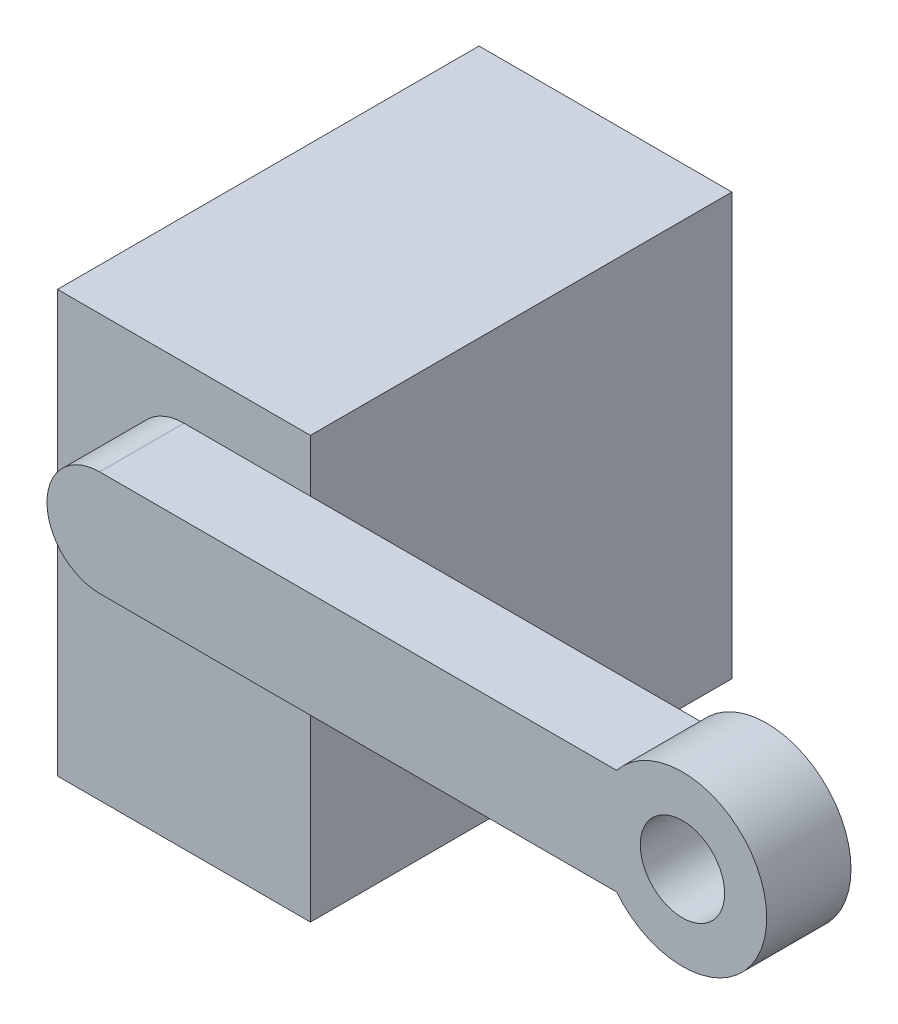
ISO-10303-21;
HEADER;
FILE_DESCRIPTION(('STEP AP214'),'2;1');
FILE_NAME('part.step','',(''),(''),'','','');
FILE_SCHEMA(('AUTOMOTIVE_DESIGN { 1 0 10303 214 1 1 1 1 }'));
ENDSEC;
DATA;
#1=APPLICATION_CONTEXT('core data for automotive mechanical design processes');
#2=APPLICATION_PROTOCOL_DEFINITION('international standard','automotive_design',2000,#1);
#3=PRODUCT_CONTEXT('',#1,'mechanical');
#4=PRODUCT('Part','Part','',(#3));
#5=PRODUCT_RELATED_PRODUCT_CATEGORY('part','',(#4));
#6=PRODUCT_DEFINITION_FORMATION('','',#4);
#7=PRODUCT_DEFINITION_CONTEXT('part definition',#1,'design');
#8=PRODUCT_DEFINITION('design','',#6,#7);
#9=PRODUCT_DEFINITION_SHAPE('','',#8);
#10=(LENGTH_UNIT() NAMED_UNIT(*) SI_UNIT(.MILLI.,.METRE.));
#11=(NAMED_UNIT(*) PLANE_ANGLE_UNIT() SI_UNIT($,.RADIAN.));
#12=(NAMED_UNIT(*) SI_UNIT($,.STERADIAN.) SOLID_ANGLE_UNIT());
#13=UNCERTAINTY_MEASURE_WITH_UNIT(LENGTH_MEASURE(1.E-05),#10,'distance_accuracy_value','');
#14=(GEOMETRIC_REPRESENTATION_CONTEXT(3) GLOBAL_UNCERTAINTY_ASSIGNED_CONTEXT((#13)) GLOBAL_UNIT_ASSIGNED_CONTEXT((#10,
#11,#12)) REPRESENTATION_CONTEXT('',''));
#15=CARTESIAN_POINT('',(0.,0.,0.));
#16=DIRECTION('',(0.,0.,1.));
#17=DIRECTION('',(1.,0.,0.));
#18=AXIS2_PLACEMENT_3D('',#15,#16,#17);
#19=CARTESIAN_POINT('',(0.,0.,20.));
#20=DIRECTION('',(0.,0.,-1.));
#21=DIRECTION('',(-1.,0.,0.));
#22=AXIS2_PLACEMENT_3D('',#19,#20,#21);
#23=PLANE('',#22);
#24=DIRECTION('',(-1.,0.,0.));
#25=VECTOR('',#24,1.);
#26=CARTESIAN_POINT('',(0.,7.5,20.));
#27=LINE('',#26,#25);
#28=CARTESIAN_POINT('',(6.,7.5,20.));
#29=VERTEX_POINT('',#28);
#30=CARTESIAN_POINT('',(0.,7.5,20.));
#31=VERTEX_POINT('',#30);
#32=EDGE_CURVE('E11',#29,#31,#27,.T.);
#33=ORIENTED_EDGE('',*,*,#32,.F.);
#34=DIRECTION('',(0.,1.,0.));
#35=VECTOR('',#34,1.);
#36=CARTESIAN_POINT('',(6.,-10.,20.));
#37=LINE('',#36,#35);
#38=CARTESIAN_POINT('',(6.,10.,20.));
#39=VERTEX_POINT('',#38);
#40=EDGE_CURVE('E137',#29,#39,#37,.T.);
#41=ORIENTED_EDGE('',*,*,#40,.T.);
#42=DIRECTION('',(-1.,0.,0.));
#43=VECTOR('',#42,1.);
#44=CARTESIAN_POINT('',(-6.,10.,20.));
#45=LINE('',#44,#43);
#46=CARTESIAN_POINT('',(-6.,10.,20.));
#47=VERTEX_POINT('',#46);
#48=EDGE_CURVE('E135',#39,#47,#45,.T.);
#49=ORIENTED_EDGE('',*,*,#48,.T.);
#50=DIRECTION('',(0.,-1.,0.));
#51=VECTOR('',#50,1.);
#52=CARTESIAN_POINT('',(-6.,-10.,20.));
#53=LINE('',#52,#51);
#54=CARTESIAN_POINT('',(-6.,-10.,20.));
#55=VERTEX_POINT('',#54);
#56=EDGE_CURVE('E139',#47,#55,#53,.T.);
#57=ORIENTED_EDGE('',*,*,#56,.T.);
#58=DIRECTION('',(1.,0.,0.));
#59=VECTOR('',#58,1.);
#60=CARTESIAN_POINT('',(-6.,-10.,20.));
#61=LINE('',#60,#59);
#62=CARTESIAN_POINT('',(6.,-10.,20.));
#63=VERTEX_POINT('',#62);
#64=EDGE_CURVE('E141',#55,#63,#61,.T.);
#65=ORIENTED_EDGE('',*,*,#64,.T.);
#66=CARTESIAN_POINT('',(6.,2.5,20.));
#67=VERTEX_POINT('',#66);
#68=EDGE_CURVE('E133',#63,#67,#37,.T.);
#69=ORIENTED_EDGE('',*,*,#68,.T.);
#70=DIRECTION('',(1.,0.,0.));
#71=VECTOR('',#70,1.);
#72=CARTESIAN_POINT('',(0.,2.5,20.));
#73=LINE('',#72,#71);
#74=CARTESIAN_POINT('',(0.,2.5,20.));
#75=VERTEX_POINT('',#74);
#76=EDGE_CURVE('E53',#75,#67,#73,.T.);
#77=ORIENTED_EDGE('',*,*,#76,.F.);
#78=CARTESIAN_POINT('',(0.,5.,20.));
#79=DIRECTION('',(0.,0.,1.));
#80=DIRECTION('',(1.,0.,0.));
#81=AXIS2_PLACEMENT_3D('',#78,#79,#80);
#82=CIRCLE('',#81,2.5);
#83=EDGE_CURVE('E49',#31,#75,#82,.T.);
#84=ORIENTED_EDGE('',*,*,#83,.F.);
#85=EDGE_LOOP('',(#33,#41,#49,#57,#65,#69,#77,#84));
#86=FACE_BOUND('',#85,.T.);
#87=ADVANCED_FACE('F32',(#86),#23,.F.);
#88=CARTESIAN_POINT('',(6.,-10.,20.));
#89=DIRECTION('',(-1.,0.,0.));
#90=DIRECTION('',(0.,0.,1.));
#91=AXIS2_PLACEMENT_3D('',#88,#89,#90);
#92=PLANE('',#91);
#93=DIRECTION('',(0.,1.,0.));
#94=VECTOR('',#93,1.);
#95=CARTESIAN_POINT('',(6.,-10.,0.));
#96=LINE('',#95,#94);
#97=CARTESIAN_POINT('',(6.,-10.,0.));
#98=VERTEX_POINT('',#97);
#99=CARTESIAN_POINT('',(6.,10.,0.));
#100=VERTEX_POINT('',#99);
#101=EDGE_CURVE('E124',#98,#100,#96,.T.);
#102=ORIENTED_EDGE('',*,*,#101,.T.);
#103=DIRECTION('',(0.,0.,-1.));
#104=VECTOR('',#103,1.);
#105=CARTESIAN_POINT('',(6.,10.,20.));
#106=LINE('',#105,#104);
#107=EDGE_CURVE('E36',#39,#100,#106,.T.);
#108=ORIENTED_EDGE('',*,*,#107,.F.);
#109=ORIENTED_EDGE('',*,*,#40,.F.);
#110=EDGE_CURVE('E136',#67,#29,#37,.T.);
#111=ORIENTED_EDGE('',*,*,#110,.F.);
#112=ORIENTED_EDGE('',*,*,#68,.F.);
#113=DIRECTION('',(0.,0.,-1.));
#114=VECTOR('',#113,1.);
#115=CARTESIAN_POINT('',(6.,-10.,20.));
#116=LINE('',#115,#114);
#117=EDGE_CURVE('E142',#63,#98,#116,.T.);
#118=ORIENTED_EDGE('',*,*,#117,.T.);
#119=EDGE_LOOP('',(#102,#108,#109,#111,#112,#118));
#120=FACE_BOUND('',#119,.T.);
#121=ADVANCED_FACE('F34',(#120),#92,.F.);
#122=CARTESIAN_POINT('',(-6.,10.,20.));
#123=DIRECTION('',(0.,-1.,0.));
#124=DIRECTION('',(0.,0.,-1.));
#125=AXIS2_PLACEMENT_3D('',#122,#123,#124);
#126=PLANE('',#125);
#127=DIRECTION('',(-1.,0.,0.));
#128=VECTOR('',#127,1.);
#129=CARTESIAN_POINT('',(-6.,10.,0.));
#130=LINE('',#129,#128);
#131=CARTESIAN_POINT('',(-6.,10.,0.));
#132=VERTEX_POINT('',#131);
#133=EDGE_CURVE('E127',#100,#132,#130,.T.);
#134=ORIENTED_EDGE('',*,*,#133,.T.);
#135=DIRECTION('',(0.,0.,-1.));
#136=VECTOR('',#135,1.);
#137=CARTESIAN_POINT('',(-6.,10.,20.));
#138=LINE('',#137,#136);
#139=EDGE_CURVE('E153',#47,#132,#138,.T.);
#140=ORIENTED_EDGE('',*,*,#139,.F.);
#141=ORIENTED_EDGE('',*,*,#48,.F.);
#142=ORIENTED_EDGE('',*,*,#107,.T.);
#143=EDGE_LOOP('',(#134,#140,#141,#142));
#144=FACE_BOUND('',#143,.T.);
#145=ADVANCED_FACE('F163',(#144),#126,.F.);
#146=CARTESIAN_POINT('',(-6.,-10.,20.));
#147=DIRECTION('',(1.,0.,0.));
#148=DIRECTION('',(0.,0.,-1.));
#149=AXIS2_PLACEMENT_3D('',#146,#147,#148);
#150=PLANE('',#149);
#151=DIRECTION('',(0.,-1.,0.));
#152=VECTOR('',#151,1.);
#153=CARTESIAN_POINT('',(-6.,-10.,0.));
#154=LINE('',#153,#152);
#155=CARTESIAN_POINT('',(-6.,-10.,0.));
#156=VERTEX_POINT('',#155);
#157=EDGE_CURVE('E145',#132,#156,#154,.T.);
#158=ORIENTED_EDGE('',*,*,#157,.T.);
#159=DIRECTION('',(0.,0.,-1.));
#160=VECTOR('',#159,1.);
#161=CARTESIAN_POINT('',(-6.,-10.,20.));
#162=LINE('',#161,#160);
#163=EDGE_CURVE('E151',#55,#156,#162,.T.);
#164=ORIENTED_EDGE('',*,*,#163,.F.);
#165=ORIENTED_EDGE('',*,*,#56,.F.);
#166=ORIENTED_EDGE('',*,*,#139,.T.);
#167=EDGE_LOOP('',(#158,#164,#165,#166));
#168=FACE_BOUND('',#167,.T.);
#169=ADVANCED_FACE('F173',(#168),#150,.F.);
#170=CARTESIAN_POINT('',(-6.,-10.,20.));
#171=DIRECTION('',(0.,1.,0.));
#172=DIRECTION('',(0.,0.,1.));
#173=AXIS2_PLACEMENT_3D('',#170,#171,#172);
#174=PLANE('',#173);
#175=DIRECTION('',(1.,0.,0.));
#176=VECTOR('',#175,1.);
#177=CARTESIAN_POINT('',(-6.,-10.,0.));
#178=LINE('',#177,#176);
#179=EDGE_CURVE('E147',#156,#98,#178,.T.);
#180=ORIENTED_EDGE('',*,*,#179,.T.);
#181=ORIENTED_EDGE('',*,*,#117,.F.);
#182=ORIENTED_EDGE('',*,*,#64,.F.);
#183=ORIENTED_EDGE('',*,*,#163,.T.);
#184=EDGE_LOOP('',(#180,#181,#182,#183));
#185=FACE_BOUND('',#184,.T.);
#186=ADVANCED_FACE('F176',(#185),#174,.F.);
#187=CARTESIAN_POINT('',(0.,0.,0.));
#188=DIRECTION('',(0.,0.,-1.));
#189=DIRECTION('',(-1.,0.,0.));
#190=AXIS2_PLACEMENT_3D('',#187,#188,#189);
#191=PLANE('',#190);
#192=ORIENTED_EDGE('',*,*,#101,.F.);
#193=ORIENTED_EDGE('',*,*,#179,.F.);
#194=ORIENTED_EDGE('',*,*,#157,.F.);
#195=ORIENTED_EDGE('',*,*,#133,.F.);
#196=EDGE_LOOP('',(#192,#193,#194,#195));
#197=FACE_BOUND('',#196,.T.);
#198=ADVANCED_FACE('F171',(#197),#191,.T.);
#199=CARTESIAN_POINT('',(0.,5.,20.));
#200=DIRECTION('',(0.,0.,1.));
#201=DIRECTION('',(1.,0.,0.));
#202=AXIS2_PLACEMENT_3D('',#199,#200,#201);
#203=PLANE('',#202);
#204=CARTESIAN_POINT('',(27.6512457902976,5.,20.));
#205=DIRECTION('',(0.,0.,1.));
#206=DIRECTION('',(1.,0.,0.));
#207=AXIS2_PLACEMENT_3D('',#204,#205,#206);
#208=CIRCLE('',#207,2.);
#209=CARTESIAN_POINT('',(29.6512457902976,5.,20.));
#210=VERTEX_POINT('',#209);
#211=EDGE_CURVE('E289',#210,#210,#208,.T.);
#212=ORIENTED_EDGE('',*,*,#211,.T.);
#213=EDGE_LOOP('',(#212));
#214=FACE_BOUND('',#213,.T.);
#215=CARTESIAN_POINT('',(24.5287467910984,2.5,20.));
#216=VERTEX_POINT('',#215);
#217=EDGE_CURVE('E185',#67,#216,#73,.T.);
#218=ORIENTED_EDGE('',*,*,#217,.F.);
#219=ORIENTED_EDGE('',*,*,#110,.T.);
#220=CARTESIAN_POINT('',(24.5287467910984,7.5,20.));
#221=VERTEX_POINT('',#220);
#222=EDGE_CURVE('E42',#221,#29,#27,.T.);
#223=ORIENTED_EDGE('',*,*,#222,.F.);
#224=CARTESIAN_POINT('',(27.6512457902976,5.,20.));
#225=DIRECTION('',(0.,0.,1.));
#226=DIRECTION('',(1.,0.,0.));
#227=AXIS2_PLACEMENT_3D('',#224,#225,#226);
#228=CIRCLE('',#227,4.);
#229=EDGE_CURVE('E190',#216,#221,#228,.T.);
#230=ORIENTED_EDGE('',*,*,#229,.F.);
#231=EDGE_LOOP('',(#218,#219,#223,#230));
#232=FACE_BOUND('',#231,.T.);
#233=ADVANCED_FACE('F183',(#214,#232),#203,.F.);
#234=CARTESIAN_POINT('',(0.,5.,24.));
#235=DIRECTION('',(0.,0.,1.));
#236=DIRECTION('',(1.,0.,0.));
#237=AXIS2_PLACEMENT_3D('',#234,#235,#236);
#238=PLANE('',#237);
#239=CARTESIAN_POINT('',(0.,5.,24.));
#240=DIRECTION('',(0.,0.,1.));
#241=DIRECTION('',(1.,0.,0.));
#242=AXIS2_PLACEMENT_3D('',#239,#240,#241);
#243=CIRCLE('',#242,2.5);
#244=CARTESIAN_POINT('',(0.,7.5,24.));
#245=VERTEX_POINT('',#244);
#246=CARTESIAN_POINT('',(0.,2.5,24.));
#247=VERTEX_POINT('',#246);
#248=EDGE_CURVE('E112',#245,#247,#243,.T.);
#249=ORIENTED_EDGE('',*,*,#248,.T.);
#250=DIRECTION('',(1.,0.,0.));
#251=VECTOR('',#250,1.);
#252=CARTESIAN_POINT('',(0.,2.5,24.));
#253=LINE('',#252,#251);
#254=CARTESIAN_POINT('',(24.5287467910984,2.5,24.));
#255=VERTEX_POINT('',#254);
#256=EDGE_CURVE('E102',#247,#255,#253,.T.);
#257=ORIENTED_EDGE('',*,*,#256,.T.);
#258=CARTESIAN_POINT('',(27.6512457902976,5.,24.));
#259=DIRECTION('',(0.,0.,1.));
#260=DIRECTION('',(1.,0.,0.));
#261=AXIS2_PLACEMENT_3D('',#258,#259,#260);
#262=CIRCLE('',#261,4.);
#263=CARTESIAN_POINT('',(24.5287467910984,7.5,24.));
#264=VERTEX_POINT('',#263);
#265=EDGE_CURVE('E111',#255,#264,#262,.T.);
#266=ORIENTED_EDGE('',*,*,#265,.T.);
#267=DIRECTION('',(-1.,0.,0.));
#268=VECTOR('',#267,1.);
#269=CARTESIAN_POINT('',(0.,7.5,24.));
#270=LINE('',#269,#268);
#271=EDGE_CURVE('E118',#264,#245,#270,.T.);
#272=ORIENTED_EDGE('',*,*,#271,.T.);
#273=EDGE_LOOP('',(#249,#257,#266,#272));
#274=FACE_BOUND('',#273,.T.);
#275=CARTESIAN_POINT('',(27.6512457902976,5.,24.));
#276=DIRECTION('',(0.,0.,1.));
#277=DIRECTION('',(1.,0.,0.));
#278=AXIS2_PLACEMENT_3D('',#275,#276,#277);
#279=CIRCLE('',#278,2.);
#280=CARTESIAN_POINT('',(29.6512457902976,5.,24.));
#281=VERTEX_POINT('',#280);
#282=EDGE_CURVE('E198',#281,#281,#279,.T.);
#283=ORIENTED_EDGE('',*,*,#282,.F.);
#284=EDGE_LOOP('',(#283));
#285=FACE_BOUND('',#284,.T.);
#286=ADVANCED_FACE('F115',(#274,#285),#238,.T.);
#287=CARTESIAN_POINT('',(0.,5.,24.));
#288=DIRECTION('',(0.,0.,-1.));
#289=DIRECTION('',(-1.,0.,0.));
#290=AXIS2_PLACEMENT_3D('',#287,#288,#289);
#291=CYLINDRICAL_SURFACE('',#290,2.5);
#292=ORIENTED_EDGE('',*,*,#83,.T.);
#293=DIRECTION('',(0.,0.,-1.));
#294=VECTOR('',#293,1.);
#295=CARTESIAN_POINT('',(0.,2.5,24.));
#296=LINE('',#295,#294);
#297=EDGE_CURVE('E106',#247,#75,#296,.T.);
#298=ORIENTED_EDGE('',*,*,#297,.F.);
#299=ORIENTED_EDGE('',*,*,#248,.F.);
#300=DIRECTION('',(0.,0.,-1.));
#301=VECTOR('',#300,1.);
#302=CARTESIAN_POINT('',(0.,7.5,24.));
#303=LINE('',#302,#301);
#304=EDGE_CURVE('E194',#245,#31,#303,.T.);
#305=ORIENTED_EDGE('',*,*,#304,.T.);
#306=EDGE_LOOP('',(#292,#298,#299,#305));
#307=FACE_BOUND('',#306,.T.);
#308=ADVANCED_FACE('F123',(#307),#291,.T.);
#309=CARTESIAN_POINT('',(0.,2.5,24.));
#310=DIRECTION('',(0.,1.,0.));
#311=DIRECTION('',(0.,0.,1.));
#312=AXIS2_PLACEMENT_3D('',#309,#310,#311);
#313=PLANE('',#312);
#314=ORIENTED_EDGE('',*,*,#76,.T.);
#315=ORIENTED_EDGE('',*,*,#217,.T.);
#316=DIRECTION('',(0.,0.,-1.));
#317=VECTOR('',#316,1.);
#318=CARTESIAN_POINT('',(24.5287467910984,2.5,24.));
#319=LINE('',#318,#317);
#320=EDGE_CURVE('E108',#255,#216,#319,.T.);
#321=ORIENTED_EDGE('',*,*,#320,.F.);
#322=ORIENTED_EDGE('',*,*,#256,.F.);
#323=ORIENTED_EDGE('',*,*,#297,.T.);
#324=EDGE_LOOP('',(#314,#315,#321,#322,#323));
#325=FACE_BOUND('',#324,.T.);
#326=ADVANCED_FACE('F104',(#325),#313,.F.);
#327=CARTESIAN_POINT('',(27.6512457902976,5.,24.));
#328=DIRECTION('',(0.,0.,-1.));
#329=DIRECTION('',(-1.,0.,0.));
#330=AXIS2_PLACEMENT_3D('',#327,#328,#329);
#331=CYLINDRICAL_SURFACE('',#330,4.);
#332=ORIENTED_EDGE('',*,*,#229,.T.);
#333=DIRECTION('',(0.,0.,-1.));
#334=VECTOR('',#333,1.);
#335=CARTESIAN_POINT('',(24.5287467910984,7.5,24.));
#336=LINE('',#335,#334);
#337=EDGE_CURVE('E129',#264,#221,#336,.T.);
#338=ORIENTED_EDGE('',*,*,#337,.F.);
#339=ORIENTED_EDGE('',*,*,#265,.F.);
#340=ORIENTED_EDGE('',*,*,#320,.T.);
#341=EDGE_LOOP('',(#332,#338,#339,#340));
#342=FACE_BOUND('',#341,.T.);
#343=ADVANCED_FACE('F200',(#342),#331,.T.);
#344=CARTESIAN_POINT('',(0.,7.5,24.));
#345=DIRECTION('',(0.,-1.,0.));
#346=DIRECTION('',(0.,0.,-1.));
#347=AXIS2_PLACEMENT_3D('',#344,#345,#346);
#348=PLANE('',#347);
#349=ORIENTED_EDGE('',*,*,#222,.T.);
#350=ORIENTED_EDGE('',*,*,#32,.T.);
#351=ORIENTED_EDGE('',*,*,#304,.F.);
#352=ORIENTED_EDGE('',*,*,#271,.F.);
#353=ORIENTED_EDGE('',*,*,#337,.T.);
#354=EDGE_LOOP('',(#349,#350,#351,#352,#353));
#355=FACE_BOUND('',#354,.T.);
#356=ADVANCED_FACE('F188',(#355),#348,.F.);
#357=CARTESIAN_POINT('',(27.6512457902976,5.,24.));
#358=DIRECTION('',(0.,0.,-1.));
#359=DIRECTION('',(-1.,0.,0.));
#360=AXIS2_PLACEMENT_3D('',#357,#358,#359);
#361=CYLINDRICAL_SURFACE('',#360,2.);
#362=ORIENTED_EDGE('',*,*,#282,.T.);
#363=EDGE_LOOP('',(#362));
#364=FACE_BOUND('',#363,.T.);
#365=ORIENTED_EDGE('',*,*,#211,.F.);
#366=EDGE_LOOP('',(#365));
#367=FACE_BOUND('',#366,.T.);
#368=ADVANCED_FACE('F207',(#364,#367),#361,.F.);
#369=CLOSED_SHELL('',(#87,#121,#145,#169,#186,#198,#233,#286,#308,#326,#343,#356,#368));
#370=MANIFOLD_SOLID_BREP('B2',#369);
#371=ADVANCED_BREP_SHAPE_REPRESENTATION('',(#18,#370),#14);
#372=SHAPE_DEFINITION_REPRESENTATION(#9,#371);
ENDSEC;
END-ISO-10303-21;
